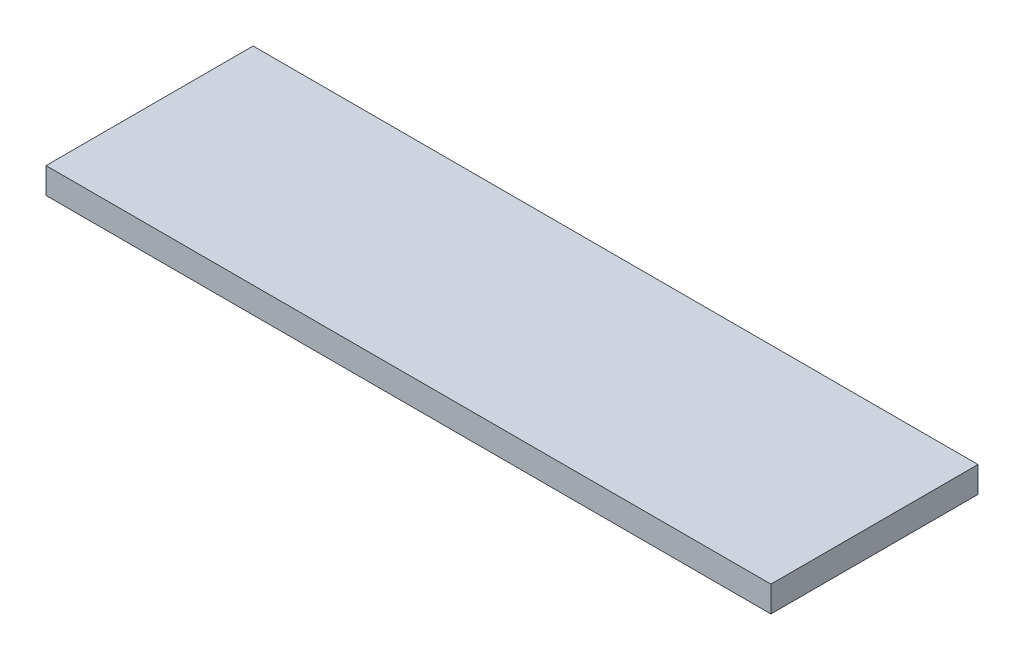
ISO-10303-21;
HEADER;
FILE_DESCRIPTION(('STEP AP214'),'2;1');
FILE_NAME('part.step','',(''),(''),'','','');
FILE_SCHEMA(('AUTOMOTIVE_DESIGN { 1 0 10303 214 1 1 1 1 }'));
ENDSEC;
DATA;
#1=APPLICATION_CONTEXT('core data for automotive mechanical design processes');
#2=APPLICATION_PROTOCOL_DEFINITION('international standard','automotive_design',2000,#1);
#3=PRODUCT_CONTEXT('',#1,'mechanical');
#4=PRODUCT('Part','Part','',(#3));
#5=PRODUCT_RELATED_PRODUCT_CATEGORY('part','',(#4));
#6=PRODUCT_DEFINITION_FORMATION('','',#4);
#7=PRODUCT_DEFINITION_CONTEXT('part definition',#1,'design');
#8=PRODUCT_DEFINITION('design','',#6,#7);
#9=PRODUCT_DEFINITION_SHAPE('','',#8);
#10=(LENGTH_UNIT() NAMED_UNIT(*) SI_UNIT(.MILLI.,.METRE.));
#11=(NAMED_UNIT(*) PLANE_ANGLE_UNIT() SI_UNIT($,.RADIAN.));
#12=(NAMED_UNIT(*) SI_UNIT($,.STERADIAN.) SOLID_ANGLE_UNIT());
#13=UNCERTAINTY_MEASURE_WITH_UNIT(LENGTH_MEASURE(1.E-05),#10,'distance_accuracy_value','');
#14=(GEOMETRIC_REPRESENTATION_CONTEXT(3) GLOBAL_UNCERTAINTY_ASSIGNED_CONTEXT((#13)) GLOBAL_UNIT_ASSIGNED_CONTEXT((#10,
#11,#12)) REPRESENTATION_CONTEXT('',''));
#15=CARTESIAN_POINT('',(0.,0.,0.));
#16=DIRECTION('',(0.,0.,1.));
#17=DIRECTION('',(1.,0.,0.));
#18=AXIS2_PLACEMENT_3D('',#15,#16,#17);
#19=CARTESIAN_POINT('',(0.,3.175,0.));
#20=DIRECTION('',(1.,0.,0.));
#21=DIRECTION('',(0.,0.,-1.));
#22=AXIS2_PLACEMENT_3D('',#19,#20,#21);
#23=PLANE('',#22);
#24=DIRECTION('',(0.,0.,1.));
#25=VECTOR('',#24,1.);
#26=CARTESIAN_POINT('',(0.,0.,0.));
#27=LINE('',#26,#25);
#28=CARTESIAN_POINT('',(0.,0.,-25.4));
#29=VERTEX_POINT('',#28);
#30=CARTESIAN_POINT('',(0.,0.,0.));
#31=VERTEX_POINT('',#30);
#32=EDGE_CURVE('E96',#29,#31,#27,.T.);
#33=ORIENTED_EDGE('',*,*,#32,.T.);
#34=DIRECTION('',(0.,-1.,0.));
#35=VECTOR('',#34,1.);
#36=CARTESIAN_POINT('',(0.,3.175,0.));
#37=LINE('',#36,#35);
#38=CARTESIAN_POINT('',(0.,3.175,0.));
#39=VERTEX_POINT('',#38);
#40=EDGE_CURVE('E11',#39,#31,#37,.T.);
#41=ORIENTED_EDGE('',*,*,#40,.F.);
#42=DIRECTION('',(0.,0.,1.));
#43=VECTOR('',#42,1.);
#44=CARTESIAN_POINT('',(0.,3.175,0.));
#45=LINE('',#44,#43);
#46=CARTESIAN_POINT('',(0.,3.175,-25.4));
#47=VERTEX_POINT('',#46);
#48=EDGE_CURVE('E84',#47,#39,#45,.T.);
#49=ORIENTED_EDGE('',*,*,#48,.F.);
#50=DIRECTION('',(0.,-1.,0.));
#51=VECTOR('',#50,1.);
#52=CARTESIAN_POINT('',(0.,3.175,-25.4));
#53=LINE('',#52,#51);
#54=EDGE_CURVE('E92',#47,#29,#53,.T.);
#55=ORIENTED_EDGE('',*,*,#54,.T.);
#56=EDGE_LOOP('',(#33,#41,#49,#55));
#57=FACE_BOUND('',#56,.T.);
#58=ADVANCED_FACE('F33',(#57),#23,.F.);
#59=CARTESIAN_POINT('',(0.,3.175,0.));
#60=DIRECTION('',(0.,0.,-1.));
#61=DIRECTION('',(-1.,0.,0.));
#62=AXIS2_PLACEMENT_3D('',#59,#60,#61);
#63=PLANE('',#62);
#64=DIRECTION('',(1.,0.,0.));
#65=VECTOR('',#64,1.);
#66=CARTESIAN_POINT('',(0.,0.,0.));
#67=LINE('',#66,#65);
#68=CARTESIAN_POINT('',(88.9,0.,0.));
#69=VERTEX_POINT('',#68);
#70=EDGE_CURVE('E88',#31,#69,#67,.T.);
#71=ORIENTED_EDGE('',*,*,#70,.T.);
#72=DIRECTION('',(0.,-1.,0.));
#73=VECTOR('',#72,1.);
#74=CARTESIAN_POINT('',(88.9,3.175,0.));
#75=LINE('',#74,#73);
#76=CARTESIAN_POINT('',(88.9,3.175,0.));
#77=VERTEX_POINT('',#76);
#78=EDGE_CURVE('E41',#77,#69,#75,.T.);
#79=ORIENTED_EDGE('',*,*,#78,.F.);
#80=DIRECTION('',(1.,0.,0.));
#81=VECTOR('',#80,1.);
#82=CARTESIAN_POINT('',(0.,3.175,0.));
#83=LINE('',#82,#81);
#84=EDGE_CURVE('E79',#39,#77,#83,.T.);
#85=ORIENTED_EDGE('',*,*,#84,.F.);
#86=ORIENTED_EDGE('',*,*,#40,.T.);
#87=EDGE_LOOP('',(#71,#79,#85,#86));
#88=FACE_BOUND('',#87,.T.);
#89=ADVANCED_FACE('F87',(#88),#63,.F.);
#90=CARTESIAN_POINT('',(88.9,3.175,0.));
#91=DIRECTION('',(-1.,0.,0.));
#92=DIRECTION('',(0.,0.,1.));
#93=AXIS2_PLACEMENT_3D('',#90,#91,#92);
#94=PLANE('',#93);
#95=DIRECTION('',(0.,0.,-1.));
#96=VECTOR('',#95,1.);
#97=CARTESIAN_POINT('',(88.9,0.,0.));
#98=LINE('',#97,#96);
#99=CARTESIAN_POINT('',(88.9,0.,-25.4));
#100=VERTEX_POINT('',#99);
#101=EDGE_CURVE('E66',#69,#100,#98,.T.);
#102=ORIENTED_EDGE('',*,*,#101,.T.);
#103=DIRECTION('',(0.,-1.,0.));
#104=VECTOR('',#103,1.);
#105=CARTESIAN_POINT('',(88.9,3.175,-25.4));
#106=LINE('',#105,#104);
#107=CARTESIAN_POINT('',(88.9,3.175,-25.4));
#108=VERTEX_POINT('',#107);
#109=EDGE_CURVE('E89',#108,#100,#106,.T.);
#110=ORIENTED_EDGE('',*,*,#109,.F.);
#111=DIRECTION('',(0.,0.,-1.));
#112=VECTOR('',#111,1.);
#113=CARTESIAN_POINT('',(88.9,3.175,0.));
#114=LINE('',#113,#112);
#115=EDGE_CURVE('E82',#77,#108,#114,.T.);
#116=ORIENTED_EDGE('',*,*,#115,.F.);
#117=ORIENTED_EDGE('',*,*,#78,.T.);
#118=EDGE_LOOP('',(#102,#110,#116,#117));
#119=FACE_BOUND('',#118,.T.);
#120=ADVANCED_FACE('F90',(#119),#94,.F.);
#121=CARTESIAN_POINT('',(0.,3.175,-25.4));
#122=DIRECTION('',(0.,0.,1.));
#123=DIRECTION('',(1.,0.,0.));
#124=AXIS2_PLACEMENT_3D('',#121,#122,#123);
#125=PLANE('',#124);
#126=DIRECTION('',(-1.,0.,0.));
#127=VECTOR('',#126,1.);
#128=CARTESIAN_POINT('',(0.,0.,-25.4));
#129=LINE('',#128,#127);
#130=EDGE_CURVE('E72',#100,#29,#129,.T.);
#131=ORIENTED_EDGE('',*,*,#130,.T.);
#132=ORIENTED_EDGE('',*,*,#54,.F.);
#133=DIRECTION('',(-1.,0.,0.));
#134=VECTOR('',#133,1.);
#135=CARTESIAN_POINT('',(0.,3.175,-25.4));
#136=LINE('',#135,#134);
#137=EDGE_CURVE('E49',#108,#47,#136,.T.);
#138=ORIENTED_EDGE('',*,*,#137,.F.);
#139=ORIENTED_EDGE('',*,*,#109,.T.);
#140=EDGE_LOOP('',(#131,#132,#138,#139));
#141=FACE_BOUND('',#140,.T.);
#142=ADVANCED_FACE('F103',(#141),#125,.F.);
#143=CARTESIAN_POINT('',(0.,3.175,0.));
#144=DIRECTION('',(0.,-1.,0.));
#145=DIRECTION('',(0.,0.,-1.));
#146=AXIS2_PLACEMENT_3D('',#143,#144,#145);
#147=PLANE('',#146);
#148=ORIENTED_EDGE('',*,*,#48,.T.);
#149=ORIENTED_EDGE('',*,*,#84,.T.);
#150=ORIENTED_EDGE('',*,*,#115,.T.);
#151=ORIENTED_EDGE('',*,*,#137,.T.);
#152=EDGE_LOOP('',(#148,#149,#150,#151));
#153=FACE_BOUND('',#152,.T.);
#154=ADVANCED_FACE('F80',(#153),#147,.F.);
#155=CARTESIAN_POINT('',(0.,0.,0.));
#156=DIRECTION('',(0.,-1.,0.));
#157=DIRECTION('',(0.,0.,-1.));
#158=AXIS2_PLACEMENT_3D('',#155,#156,#157);
#159=PLANE('',#158);
#160=ORIENTED_EDGE('',*,*,#32,.F.);
#161=ORIENTED_EDGE('',*,*,#130,.F.);
#162=ORIENTED_EDGE('',*,*,#101,.F.);
#163=ORIENTED_EDGE('',*,*,#70,.F.);
#164=EDGE_LOOP('',(#160,#161,#162,#163));
#165=FACE_BOUND('',#164,.T.);
#166=ADVANCED_FACE('F106',(#165),#159,.T.);
#167=CLOSED_SHELL('',(#58,#89,#120,#142,#154,#166));
#168=MANIFOLD_SOLID_BREP('B2',#167);
#169=ADVANCED_BREP_SHAPE_REPRESENTATION('',(#18,#168),#14);
#170=SHAPE_DEFINITION_REPRESENTATION(#9,#169);
ENDSEC;
END-ISO-10303-21;
